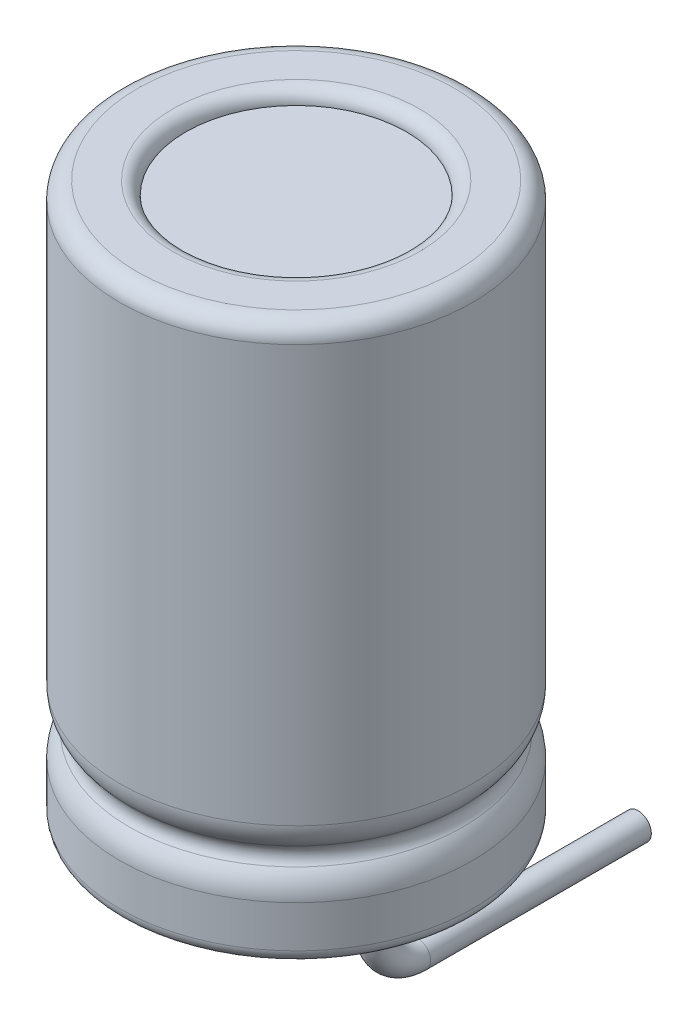
ISO-10303-21;
HEADER;
FILE_DESCRIPTION(('STEP AP214'),'2;1');
FILE_NAME('part.step','',(''),(''),'','','');
FILE_SCHEMA(('AUTOMOTIVE_DESIGN { 1 0 10303 214 1 1 1 1 }'));
ENDSEC;
DATA;
#1=APPLICATION_CONTEXT('core data for automotive mechanical design processes');
#2=APPLICATION_PROTOCOL_DEFINITION('international standard','automotive_design',2000,#1);
#3=PRODUCT_CONTEXT('',#1,'mechanical');
#4=PRODUCT('Part','Part','',(#3));
#5=PRODUCT_RELATED_PRODUCT_CATEGORY('part','',(#4));
#6=PRODUCT_DEFINITION_FORMATION('','',#4);
#7=PRODUCT_DEFINITION_CONTEXT('part definition',#1,'design');
#8=PRODUCT_DEFINITION('design','',#6,#7);
#9=PRODUCT_DEFINITION_SHAPE('','',#8);
#10=(LENGTH_UNIT() NAMED_UNIT(*) SI_UNIT(.MILLI.,.METRE.));
#11=(NAMED_UNIT(*) PLANE_ANGLE_UNIT() SI_UNIT($,.RADIAN.));
#12=(NAMED_UNIT(*) SI_UNIT($,.STERADIAN.) SOLID_ANGLE_UNIT());
#13=UNCERTAINTY_MEASURE_WITH_UNIT(LENGTH_MEASURE(1.E-05),#10,'distance_accuracy_value','');
#14=(GEOMETRIC_REPRESENTATION_CONTEXT(3) GLOBAL_UNCERTAINTY_ASSIGNED_CONTEXT((#13)) GLOBAL_UNIT_ASSIGNED_CONTEXT((#10,
#11,#12)) REPRESENTATION_CONTEXT('',''));
#15=CARTESIAN_POINT('',(0.,0.,0.));
#16=DIRECTION('',(0.,0.,1.));
#17=DIRECTION('',(1.,0.,0.));
#18=AXIS2_PLACEMENT_3D('',#15,#16,#17);
#19=CARTESIAN_POINT('',(1.75,0.3,0.));
#20=DIRECTION('',(0.,-1.,0.));
#21=DIRECTION('',(0.,0.,-1.));
#22=AXIS2_PLACEMENT_3D('',#19,#20,#21);
#23=PLANE('',#22);
#24=CARTESIAN_POINT('',(1.75,0.3,0.));
#25=DIRECTION('',(0.,1.,0.));
#26=DIRECTION('',(0.,0.,-1.));
#27=AXIS2_PLACEMENT_3D('',#24,#25,#26);
#28=CIRCLE('',#27,0.3);
#29=CARTESIAN_POINT('',(1.75,0.3,-0.3));
#30=VERTEX_POINT('',#29);
#31=EDGE_CURVE('E58',#30,#30,#28,.T.);
#32=ORIENTED_EDGE('',*,*,#31,.T.);
#33=EDGE_LOOP('',(#32));
#34=FACE_BOUND('',#33,.T.);
#35=ADVANCED_FACE('F46',(#34),#23,.F.);
#36=CARTESIAN_POINT('',(1.75,-2.2,-6.));
#37=DIRECTION('',(0.,0.,-1.));
#38=DIRECTION('',(0.,1.,0.));
#39=AXIS2_PLACEMENT_3D('',#36,#37,#38);
#40=PLANE('',#39);
#41=CARTESIAN_POINT('',(1.75,-2.2,-6.));
#42=DIRECTION('',(0.,0.,1.));
#43=DIRECTION('',(0.,1.,0.));
#44=AXIS2_PLACEMENT_3D('',#41,#42,#43);
#45=CIRCLE('',#44,0.3);
#46=CARTESIAN_POINT('',(1.75,-1.9,-6.));
#47=VERTEX_POINT('',#46);
#48=EDGE_CURVE('E12',#47,#47,#45,.T.);
#49=ORIENTED_EDGE('',*,*,#48,.F.);
#50=EDGE_LOOP('',(#49));
#51=FACE_BOUND('',#50,.T.);
#52=ADVANCED_FACE('F64',(#51),#40,.T.);
#53=CARTESIAN_POINT('',(1.75,0.3,0.));
#54=DIRECTION('',(0.,-1.,0.));
#55=DIRECTION('',(0.,0.,-1.));
#56=AXIS2_PLACEMENT_3D('',#53,#54,#55);
#57=CYLINDRICAL_SURFACE('',#56,0.3);
#58=CARTESIAN_POINT('',(1.75,-1.2,0.));
#59=DIRECTION('',(0.,1.,0.));
#60=DIRECTION('',(0.,0.,-1.));
#61=AXIS2_PLACEMENT_3D('',#58,#59,#60);
#62=CIRCLE('',#61,0.3);
#63=CARTESIAN_POINT('',(1.75,-1.2,0.3));
#64=VERTEX_POINT('',#63);
#65=EDGE_CURVE('E86',#64,#64,#62,.T.);
#66=ORIENTED_EDGE('',*,*,#65,.T.);
#67=EDGE_LOOP('',(#66));
#68=FACE_BOUND('',#67,.T.);
#69=ORIENTED_EDGE('',*,*,#31,.F.);
#70=EDGE_LOOP('',(#69));
#71=FACE_BOUND('',#70,.T.);
#72=ADVANCED_FACE('F66',(#68,#71),#57,.T.);
#73=CARTESIAN_POINT('',(1.75,-1.2,-1.));
#74=DIRECTION('',(-1.,0.,0.));
#75=DIRECTION('',(0.,0.,-1.));
#76=AXIS2_PLACEMENT_3D('',#73,#74,#75);
#77=TOROIDAL_SURFACE('',#76,1.,0.3);
#78=CARTESIAN_POINT('',(1.75,-2.2,-1.));
#79=DIRECTION('',(0.,0.,1.));
#80=DIRECTION('',(0.,1.,0.));
#81=AXIS2_PLACEMENT_3D('',#78,#79,#80);
#82=CIRCLE('',#81,0.3);
#83=CARTESIAN_POINT('',(1.75,-2.5,-1.));
#84=VERTEX_POINT('',#83);
#85=EDGE_CURVE('E53',#84,#84,#82,.T.);
#86=CARTESIAN_POINT('',(1.75,-1.2,-1.));
#87=DIRECTION('',(-1.,0.,0.));
#88=DIRECTION('',(0.,0.,-1.));
#89=AXIS2_PLACEMENT_3D('',#86,#87,#88);
#90=CIRCLE('',#89,1.3);
#91=EDGE_CURVE('',#84,#64,#90,.T.);
#92=ORIENTED_EDGE('',*,*,#85,.T.);
#93=ORIENTED_EDGE('',*,*,#65,.F.);
#94=ORIENTED_EDGE('',*,*,#91,.T.);
#95=ORIENTED_EDGE('',*,*,#91,.F.);
#96=EDGE_LOOP('',(#92,#94,#93,#95));
#97=FACE_BOUND('',#96,.T.);
#98=ADVANCED_FACE('F71',(#97),#77,.T.);
#99=CARTESIAN_POINT('',(1.75,-2.2,-1.));
#100=DIRECTION('',(0.,0.,-1.));
#101=DIRECTION('',(0.,1.,0.));
#102=AXIS2_PLACEMENT_3D('',#99,#100,#101);
#103=CYLINDRICAL_SURFACE('',#102,0.3);
#104=ORIENTED_EDGE('',*,*,#48,.T.);
#105=EDGE_LOOP('',(#104));
#106=FACE_BOUND('',#105,.T.);
#107=ORIENTED_EDGE('',*,*,#85,.F.);
#108=EDGE_LOOP('',(#107));
#109=FACE_BOUND('',#108,.T.);
#110=ADVANCED_FACE('F61',(#106,#109),#103,.T.);
#111=CLOSED_SHELL('',(#35,#52,#72,#98,#110));
#112=MANIFOLD_SOLID_BREP('B2',#111);
#113=CARTESIAN_POINT('',(-1.75,0.3,0.));
#114=DIRECTION('',(0.,-1.,0.));
#115=DIRECTION('',(0.,0.,-1.));
#116=AXIS2_PLACEMENT_3D('',#113,#114,#115);
#117=PLANE('',#116);
#118=CARTESIAN_POINT('',(-1.75,0.3,0.));
#119=DIRECTION('',(0.,-1.,0.));
#120=DIRECTION('',(0.,0.,-1.));
#121=AXIS2_PLACEMENT_3D('',#118,#119,#120);
#122=CIRCLE('',#121,0.3);
#123=CARTESIAN_POINT('',(-1.75,0.3,-0.3));
#124=VERTEX_POINT('',#123);
#125=EDGE_CURVE('E148',#124,#124,#122,.T.);
#126=ORIENTED_EDGE('',*,*,#125,.F.);
#127=EDGE_LOOP('',(#126));
#128=FACE_BOUND('',#127,.T.);
#129=ADVANCED_FACE('F136',(#128),#117,.F.);
#130=CARTESIAN_POINT('',(-1.75,-2.2,-6.));
#131=DIRECTION('',(0.,0.,-1.));
#132=DIRECTION('',(0.,1.,0.));
#133=AXIS2_PLACEMENT_3D('',#130,#131,#132);
#134=PLANE('',#133);
#135=CARTESIAN_POINT('',(-1.75,-2.2,-6.));
#136=DIRECTION('',(0.,0.,-1.));
#137=DIRECTION('',(0.,1.,0.));
#138=AXIS2_PLACEMENT_3D('',#135,#136,#137);
#139=CIRCLE('',#138,0.3);
#140=CARTESIAN_POINT('',(-1.75,-1.9,-6.));
#141=VERTEX_POINT('',#140);
#142=EDGE_CURVE('E44',#141,#141,#139,.T.);
#143=ORIENTED_EDGE('',*,*,#142,.T.);
#144=EDGE_LOOP('',(#143));
#145=FACE_BOUND('',#144,.T.);
#146=ADVANCED_FACE('F151',(#145),#134,.T.);
#147=CARTESIAN_POINT('',(-1.75,0.3,0.));
#148=DIRECTION('',(0.,-1.,0.));
#149=DIRECTION('',(0.,0.,-1.));
#150=AXIS2_PLACEMENT_3D('',#147,#148,#149);
#151=CYLINDRICAL_SURFACE('',#150,0.3);
#152=CARTESIAN_POINT('',(-1.75,-1.2,0.));
#153=DIRECTION('',(0.,-1.,0.));
#154=DIRECTION('',(0.,0.,-1.));
#155=AXIS2_PLACEMENT_3D('',#152,#153,#154);
#156=CIRCLE('',#155,0.3);
#157=CARTESIAN_POINT('',(-1.75,-1.2,0.3));
#158=VERTEX_POINT('',#157);
#159=EDGE_CURVE('E161',#158,#158,#156,.T.);
#160=ORIENTED_EDGE('',*,*,#159,.F.);
#161=EDGE_LOOP('',(#160));
#162=FACE_BOUND('',#161,.T.);
#163=ORIENTED_EDGE('',*,*,#125,.T.);
#164=EDGE_LOOP('',(#163));
#165=FACE_BOUND('',#164,.T.);
#166=ADVANCED_FACE('F166',(#162,#165),#151,.T.);
#167=CARTESIAN_POINT('',(-1.75,-1.2,-1.));
#168=DIRECTION('',(1.,0.,0.));
#169=DIRECTION('',(0.,0.,-1.));
#170=AXIS2_PLACEMENT_3D('',#167,#168,#169);
#171=TOROIDAL_SURFACE('',#170,1.,0.3);
#172=CARTESIAN_POINT('',(-1.75,-2.2,-1.));
#173=DIRECTION('',(0.,0.,-1.));
#174=DIRECTION('',(0.,1.,0.));
#175=AXIS2_PLACEMENT_3D('',#172,#173,#174);
#176=CIRCLE('',#175,0.3);
#177=CARTESIAN_POINT('',(-1.75,-2.5,-1.));
#178=VERTEX_POINT('',#177);
#179=EDGE_CURVE('E143',#178,#178,#176,.T.);
#180=CARTESIAN_POINT('',(-1.75,-1.2,-1.));
#181=DIRECTION('',(1.,0.,0.));
#182=DIRECTION('',(0.,0.,-1.));
#183=AXIS2_PLACEMENT_3D('',#180,#181,#182);
#184=CIRCLE('',#183,1.3);
#185=EDGE_CURVE('',#158,#178,#184,.T.);
#186=ORIENTED_EDGE('',*,*,#159,.T.);
#187=ORIENTED_EDGE('',*,*,#179,.F.);
#188=ORIENTED_EDGE('',*,*,#185,.T.);
#189=ORIENTED_EDGE('',*,*,#185,.F.);
#190=EDGE_LOOP('',(#186,#188,#187,#189));
#191=FACE_BOUND('',#190,.T.);
#192=ADVANCED_FACE('F156',(#191),#171,.T.);
#193=CARTESIAN_POINT('',(-1.75,-2.2,-1.));
#194=DIRECTION('',(0.,0.,-1.));
#195=DIRECTION('',(0.,1.,0.));
#196=AXIS2_PLACEMENT_3D('',#193,#194,#195);
#197=CYLINDRICAL_SURFACE('',#196,0.3);
#198=ORIENTED_EDGE('',*,*,#142,.F.);
#199=EDGE_LOOP('',(#198));
#200=FACE_BOUND('',#199,.T.);
#201=ORIENTED_EDGE('',*,*,#179,.T.);
#202=EDGE_LOOP('',(#201));
#203=FACE_BOUND('',#202,.T.);
#204=ADVANCED_FACE('F153',(#200,#203),#197,.T.);
#205=CLOSED_SHELL('',(#129,#146,#166,#192,#204));
#206=MANIFOLD_SOLID_BREP('B6',#205);
#207=CARTESIAN_POINT('',(0.,12.6,0.));
#208=DIRECTION('',(0.,-1.,0.));
#209=DIRECTION('',(0.,0.,-1.));
#210=AXIS2_PLACEMENT_3D('',#207,#208,#209);
#211=CYLINDRICAL_SURFACE('',#210,4.);
#212=CARTESIAN_POINT('',(0.,0.3,0.));
#213=DIRECTION('',(0.,1.,0.));
#214=DIRECTION('',(0.,0.,1.));
#215=AXIS2_PLACEMENT_3D('',#212,#213,#214);
#216=CIRCLE('',#215,4.);
#217=CARTESIAN_POINT('',(0.,0.3,4.));
#218=VERTEX_POINT('',#217);
#219=EDGE_CURVE('E216',#218,#218,#216,.T.);
#220=ORIENTED_EDGE('',*,*,#219,.T.);
#221=EDGE_LOOP('',(#220));
#222=FACE_BOUND('',#221,.T.);
#223=CARTESIAN_POINT('',(0.,1.24501655647292,0.));
#224=DIRECTION('',(0.,1.,0.));
#225=DIRECTION('',(0.,0.,1.));
#226=AXIS2_PLACEMENT_3D('',#223,#224,#225);
#227=CIRCLE('',#226,4.);
#228=CARTESIAN_POINT('',(0.,1.24501655647292,4.));
#229=VERTEX_POINT('',#228);
#230=EDGE_CURVE('E241',#229,#229,#227,.F.);
#231=ORIENTED_EDGE('',*,*,#230,.T.);
#232=EDGE_LOOP('',(#231));
#233=FACE_BOUND('',#232,.T.);
#234=ADVANCED_FACE('F209',(#222,#233),#211,.T.);
#235=CARTESIAN_POINT('',(0.,0.,0.));
#236=DIRECTION('',(0.,1.,0.));
#237=DIRECTION('',(0.,0.,1.));
#238=AXIS2_PLACEMENT_3D('',#235,#236,#237);
#239=PLANE('',#238);
#240=CARTESIAN_POINT('',(0.,0.,0.));
#241=DIRECTION('',(0.,1.,0.));
#242=DIRECTION('',(0.,0.,1.));
#243=AXIS2_PLACEMENT_3D('',#240,#241,#242);
#244=CIRCLE('',#243,3.7);
#245=CARTESIAN_POINT('',(0.,0.,3.7));
#246=VERTEX_POINT('',#245);
#247=EDGE_CURVE('E135',#246,#246,#244,.F.);
#248=ORIENTED_EDGE('',*,*,#247,.T.);
#249=EDGE_LOOP('',(#248));
#250=FACE_BOUND('',#249,.T.);
#251=CARTESIAN_POINT('',(0.,0.,0.));
#252=DIRECTION('',(0.,1.,0.));
#253=DIRECTION('',(0.,0.,1.));
#254=AXIS2_PLACEMENT_3D('',#251,#252,#253);
#255=CIRCLE('',#254,2.8);
#256=CARTESIAN_POINT('',(0.,0.,2.8));
#257=VERTEX_POINT('',#256);
#258=EDGE_CURVE('E244',#257,#257,#255,.T.);
#259=ORIENTED_EDGE('',*,*,#258,.T.);
#260=EDGE_LOOP('',(#259));
#261=FACE_BOUND('',#260,.T.);
#262=ADVANCED_FACE('F270',(#250,#261),#239,.F.);
#263=CARTESIAN_POINT('',(0.,0.3,0.));
#264=DIRECTION('',(0.,-1.,0.));
#265=DIRECTION('',(0.,0.,-1.));
#266=AXIS2_PLACEMENT_3D('',#263,#264,#265);
#267=PLANE('',#266);
#268=CARTESIAN_POINT('',(0.,0.3,0.));
#269=DIRECTION('',(0.,-1.,0.));
#270=DIRECTION('',(0.,0.,-1.));
#271=AXIS2_PLACEMENT_3D('',#268,#269,#270);
#272=CIRCLE('',#271,2.5);
#273=CARTESIAN_POINT('',(0.,0.3,-2.5));
#274=VERTEX_POINT('',#273);
#275=EDGE_CURVE('E247',#274,#274,#272,.T.);
#276=ORIENTED_EDGE('',*,*,#275,.T.);
#277=EDGE_LOOP('',(#276));
#278=FACE_BOUND('',#277,.T.);
#279=ADVANCED_FACE('F276',(#278),#267,.T.);
#280=CARTESIAN_POINT('',(0.,2.,0.));
#281=DIRECTION('',(0.,-1.,0.));
#282=DIRECTION('',(0.,0.,-1.));
#283=AXIS2_PLACEMENT_3D('',#280,#281,#282);
#284=TOROIDAL_SURFACE('',#283,4.,0.3);
#285=CARTESIAN_POINT('',(0.,1.79409542449263,0.));
#286=DIRECTION('',(0.,1.,0.));
#287=DIRECTION('',(0.,0.,1.));
#288=AXIS2_PLACEMENT_3D('',#285,#286,#287);
#289=CIRCLE('',#288,3.7818181818182);
#290=CARTESIAN_POINT('',(0.,1.79409542449263,3.7818181818182));
#291=VERTEX_POINT('',#290);
#292=EDGE_CURVE('E235',#291,#291,#289,.T.);
#293=ORIENTED_EDGE('',*,*,#292,.T.);
#294=EDGE_LOOP('',(#293));
#295=FACE_BOUND('',#294,.T.);
#296=CARTESIAN_POINT('',(0.,2.20590457550739,0.));
#297=DIRECTION('',(0.,-1.,0.));
#298=DIRECTION('',(0.,0.,-1.));
#299=AXIS2_PLACEMENT_3D('',#296,#297,#298);
#300=CIRCLE('',#299,3.78181818181818);
#301=CARTESIAN_POINT('',(0.,2.20590457550739,-3.78181818181818));
#302=VERTEX_POINT('',#301);
#303=EDGE_CURVE('E238',#302,#302,#300,.T.);
#304=ORIENTED_EDGE('',*,*,#303,.T.);
#305=EDGE_LOOP('',(#304));
#306=FACE_BOUND('',#305,.T.);
#307=ADVANCED_FACE('F301',(#295,#306),#284,.F.);
#308=CARTESIAN_POINT('',(0.,12.3,0.));
#309=DIRECTION('',(0.,1.,0.));
#310=DIRECTION('',(0.,0.,1.));
#311=AXIS2_PLACEMENT_3D('',#308,#309,#310);
#312=PLANE('',#311);
#313=CARTESIAN_POINT('',(0.,12.3,0.));
#314=DIRECTION('',(0.,1.,0.));
#315=DIRECTION('',(0.,0.,1.));
#316=AXIS2_PLACEMENT_3D('',#313,#314,#315);
#317=CIRCLE('',#316,2.5);
#318=CARTESIAN_POINT('',(0.,12.3,2.5));
#319=VERTEX_POINT('',#318);
#320=EDGE_CURVE('E250',#319,#319,#317,.T.);
#321=ORIENTED_EDGE('',*,*,#320,.T.);
#322=EDGE_LOOP('',(#321));
#323=FACE_BOUND('',#322,.T.);
#324=ADVANCED_FACE('F254',(#323),#312,.T.);
#325=CARTESIAN_POINT('',(0.,12.6,0.));
#326=DIRECTION('',(0.,1.,0.));
#327=DIRECTION('',(0.,0.,1.));
#328=AXIS2_PLACEMENT_3D('',#325,#326,#327);
#329=PLANE('',#328);
#330=CARTESIAN_POINT('',(0.,12.6,0.));
#331=DIRECTION('',(0.,1.,0.));
#332=DIRECTION('',(0.,0.,1.));
#333=AXIS2_PLACEMENT_3D('',#330,#331,#332);
#334=CIRCLE('',#333,2.8);
#335=CARTESIAN_POINT('',(0.,12.6,2.8));
#336=VERTEX_POINT('',#335);
#337=EDGE_CURVE('E220',#336,#336,#334,.F.);
#338=ORIENTED_EDGE('',*,*,#337,.T.);
#339=EDGE_LOOP('',(#338));
#340=FACE_BOUND('',#339,.T.);
#341=CARTESIAN_POINT('',(0.,12.6,0.));
#342=DIRECTION('',(0.,1.,0.));
#343=DIRECTION('',(0.,0.,1.));
#344=AXIS2_PLACEMENT_3D('',#341,#342,#343);
#345=CIRCLE('',#344,3.6);
#346=CARTESIAN_POINT('',(0.,12.6,3.6));
#347=VERTEX_POINT('',#346);
#348=EDGE_CURVE('E229',#347,#347,#345,.T.);
#349=ORIENTED_EDGE('',*,*,#348,.T.);
#350=EDGE_LOOP('',(#349));
#351=FACE_BOUND('',#350,.T.);
#352=ADVANCED_FACE('F282',(#340,#351),#329,.T.);
#353=CARTESIAN_POINT('',(0.,12.2,0.));
#354=DIRECTION('',(0.,1.,0.));
#355=DIRECTION('',(0.,0.,1.));
#356=AXIS2_PLACEMENT_3D('',#353,#354,#355);
#357=CIRCLE('',#356,4.);
#358=CARTESIAN_POINT('',(0.,12.2,4.));
#359=VERTEX_POINT('',#358);
#360=EDGE_CURVE('E224',#359,#359,#357,.F.);
#361=ORIENTED_EDGE('',*,*,#360,.T.);
#362=EDGE_LOOP('',(#361));
#363=FACE_BOUND('',#362,.T.);
#364=CARTESIAN_POINT('',(0.,2.75498344352707,0.));
#365=DIRECTION('',(0.,1.,0.));
#366=DIRECTION('',(0.,0.,1.));
#367=AXIS2_PLACEMENT_3D('',#364,#365,#366);
#368=CIRCLE('',#367,4.);
#369=CARTESIAN_POINT('',(0.,2.75498344352707,4.));
#370=VERTEX_POINT('',#369);
#371=EDGE_CURVE('E232',#370,#370,#368,.T.);
#372=ORIENTED_EDGE('',*,*,#371,.T.);
#373=EDGE_LOOP('',(#372));
#374=FACE_BOUND('',#373,.T.);
#375=ADVANCED_FACE('F272',(#363,#374),#211,.T.);
#376=CARTESIAN_POINT('',(0.,0.3,0.));
#377=DIRECTION('',(0.,1.,0.));
#378=DIRECTION('',(0.,0.,1.));
#379=AXIS2_PLACEMENT_3D('',#376,#377,#378);
#380=TOROIDAL_SURFACE('',#379,2.8,0.3);
#381=ORIENTED_EDGE('',*,*,#258,.F.);
#382=EDGE_LOOP('',(#381));
#383=FACE_BOUND('',#382,.T.);
#384=ORIENTED_EDGE('',*,*,#275,.F.);
#385=EDGE_LOOP('',(#384));
#386=FACE_BOUND('',#385,.T.);
#387=ADVANCED_FACE('F281',(#383,#386),#380,.T.);
#388=CARTESIAN_POINT('',(0.,1.24501655647292,0.));
#389=DIRECTION('',(0.,1.,0.));
#390=DIRECTION('',(0.,0.,1.));
#391=AXIS2_PLACEMENT_3D('',#388,#389,#390);
#392=TOROIDAL_SURFACE('',#391,3.2,0.8);
#393=ORIENTED_EDGE('',*,*,#292,.F.);
#394=EDGE_LOOP('',(#393));
#395=FACE_BOUND('',#394,.T.);
#396=ORIENTED_EDGE('',*,*,#230,.F.);
#397=EDGE_LOOP('',(#396));
#398=FACE_BOUND('',#397,.T.);
#399=ADVANCED_FACE('F288',(#395,#398),#392,.T.);
#400=CARTESIAN_POINT('',(0.,2.75498344352707,0.));
#401=DIRECTION('',(0.,1.,0.));
#402=DIRECTION('',(0.,0.,1.));
#403=AXIS2_PLACEMENT_3D('',#400,#401,#402);
#404=TOROIDAL_SURFACE('',#403,3.2,0.8);
#405=ORIENTED_EDGE('',*,*,#371,.F.);
#406=EDGE_LOOP('',(#405));
#407=FACE_BOUND('',#406,.T.);
#408=ORIENTED_EDGE('',*,*,#303,.F.);
#409=EDGE_LOOP('',(#408));
#410=FACE_BOUND('',#409,.T.);
#411=ADVANCED_FACE('F265',(#407,#410),#404,.T.);
#412=CARTESIAN_POINT('',(0.,12.2,0.));
#413=DIRECTION('',(0.,1.,0.));
#414=DIRECTION('',(0.,0.,1.));
#415=AXIS2_PLACEMENT_3D('',#412,#413,#414);
#416=TOROIDAL_SURFACE('',#415,3.6,0.4);
#417=ORIENTED_EDGE('',*,*,#360,.F.);
#418=EDGE_LOOP('',(#417));
#419=FACE_BOUND('',#418,.T.);
#420=ORIENTED_EDGE('',*,*,#348,.F.);
#421=EDGE_LOOP('',(#420));
#422=FACE_BOUND('',#421,.T.);
#423=ADVANCED_FACE('F258',(#419,#422),#416,.T.);
#424=CARTESIAN_POINT('',(0.,12.3,0.));
#425=DIRECTION('',(0.,1.,0.));
#426=DIRECTION('',(0.,0.,1.));
#427=AXIS2_PLACEMENT_3D('',#424,#425,#426);
#428=TOROIDAL_SURFACE('',#427,2.8,0.3);
#429=ORIENTED_EDGE('',*,*,#337,.F.);
#430=EDGE_LOOP('',(#429));
#431=FACE_BOUND('',#430,.T.);
#432=ORIENTED_EDGE('',*,*,#320,.F.);
#433=EDGE_LOOP('',(#432));
#434=FACE_BOUND('',#433,.T.);
#435=ADVANCED_FACE('F256',(#431,#434),#428,.T.);
#436=CARTESIAN_POINT('',(0.,0.3,0.));
#437=DIRECTION('',(0.,1.,0.));
#438=DIRECTION('',(0.,0.,1.));
#439=AXIS2_PLACEMENT_3D('',#436,#437,#438);
#440=TOROIDAL_SURFACE('',#439,3.7,0.3);
#441=ORIENTED_EDGE('',*,*,#247,.F.);
#442=EDGE_LOOP('',(#441));
#443=FACE_BOUND('',#442,.T.);
#444=ORIENTED_EDGE('',*,*,#219,.F.);
#445=EDGE_LOOP('',(#444));
#446=FACE_BOUND('',#445,.T.);
#447=ADVANCED_FACE('F211',(#443,#446),#440,.T.);
#448=CLOSED_SHELL('',(#234,#262,#279,#307,#324,#352,#375,#387,#399,#411,#423,#435,#447));
#449=MANIFOLD_SOLID_BREP('B38',#448);
#450=ADVANCED_BREP_SHAPE_REPRESENTATION('',(#18,#112,#206,#449),#14);
#451=SHAPE_DEFINITION_REPRESENTATION(#9,#450);
ENDSEC;
END-ISO-10303-21;
